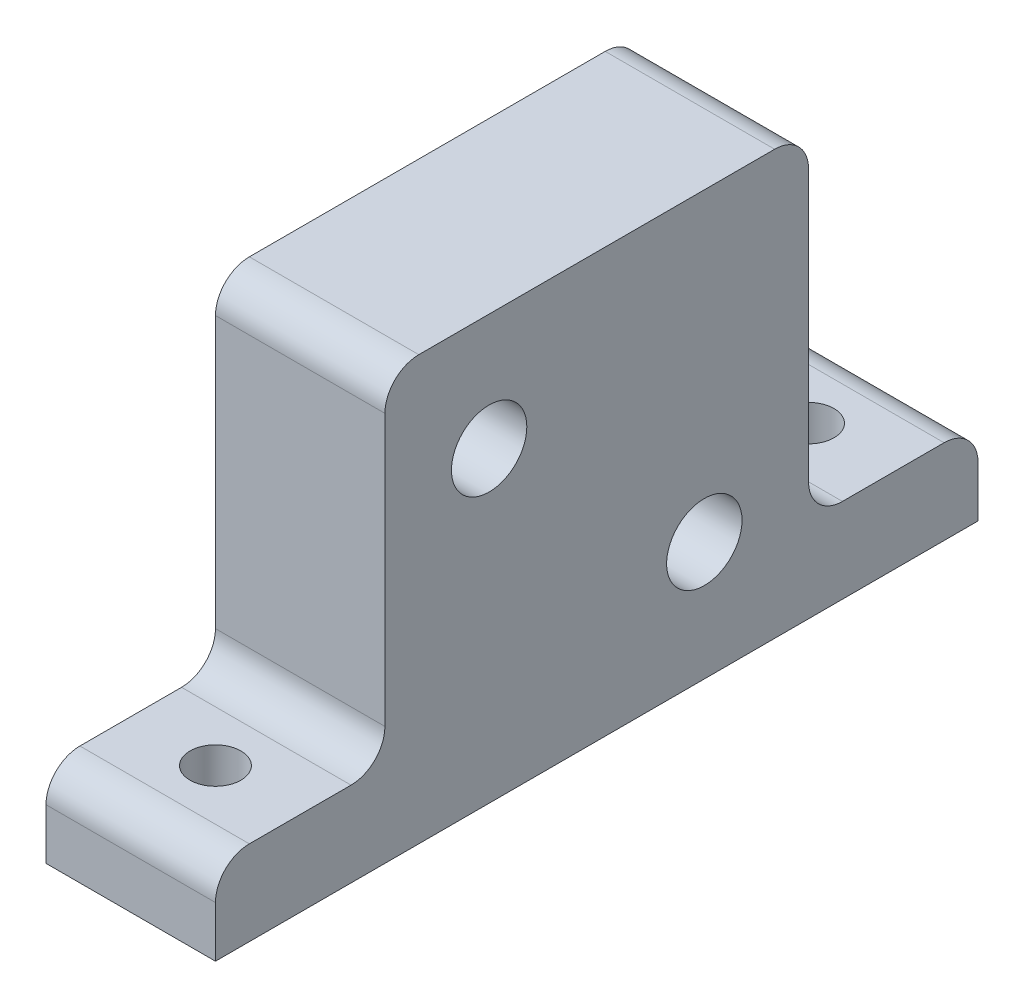
ISO-10303-21;
HEADER;
FILE_DESCRIPTION(('STEP AP214'),'2;1');
FILE_NAME('part.step','',(''),(''),'','','');
FILE_SCHEMA(('AUTOMOTIVE_DESIGN { 1 0 10303 214 1 1 1 1 }'));
ENDSEC;
DATA;
#1=APPLICATION_CONTEXT('core data for automotive mechanical design processes');
#2=APPLICATION_PROTOCOL_DEFINITION('international standard','automotive_design',2000,#1);
#3=PRODUCT_CONTEXT('',#1,'mechanical');
#4=PRODUCT('Part','Part','',(#3));
#5=PRODUCT_RELATED_PRODUCT_CATEGORY('part','',(#4));
#6=PRODUCT_DEFINITION_FORMATION('','',#4);
#7=PRODUCT_DEFINITION_CONTEXT('part definition',#1,'design');
#8=PRODUCT_DEFINITION('design','',#6,#7);
#9=PRODUCT_DEFINITION_SHAPE('','',#8);
#10=(LENGTH_UNIT() NAMED_UNIT(*) SI_UNIT(.MILLI.,.METRE.));
#11=(NAMED_UNIT(*) PLANE_ANGLE_UNIT() SI_UNIT($,.RADIAN.));
#12=(NAMED_UNIT(*) SI_UNIT($,.STERADIAN.) SOLID_ANGLE_UNIT());
#13=UNCERTAINTY_MEASURE_WITH_UNIT(LENGTH_MEASURE(1.E-05),#10,'distance_accuracy_value','');
#14=(GEOMETRIC_REPRESENTATION_CONTEXT(3) GLOBAL_UNCERTAINTY_ASSIGNED_CONTEXT((#13)) GLOBAL_UNIT_ASSIGNED_CONTEXT((#10,
#11,#12)) REPRESENTATION_CONTEXT('',''));
#15=CARTESIAN_POINT('',(0.,0.,0.));
#16=DIRECTION('',(0.,0.,1.));
#17=DIRECTION('',(1.,0.,0.));
#18=AXIS2_PLACEMENT_3D('',#15,#16,#17);
#19=CARTESIAN_POINT('',(165.,0.,97.5));
#20=DIRECTION('',(0.,0.,1.));
#21=DIRECTION('',(1.,0.,0.));
#22=AXIS2_PLACEMENT_3D('',#19,#20,#21);
#23=PLANE('',#22);
#24=DIRECTION('',(0.,1.,0.));
#25=VECTOR('',#24,1.);
#26=CARTESIAN_POINT('',(165.,0.,97.5));
#27=LINE('',#26,#25);
#28=CARTESIAN_POINT('',(165.,15.,97.5));
#29=VERTEX_POINT('',#28);
#30=CARTESIAN_POINT('',(165.,18.,97.5));
#31=VERTEX_POINT('',#30);
#32=EDGE_CURVE('E147',#29,#31,#27,.T.);
#33=ORIENTED_EDGE('',*,*,#32,.T.);
#34=DIRECTION('',(-1.,0.,0.));
#35=VECTOR('',#34,1.);
#36=CARTESIAN_POINT('',(165.,18.,97.5));
#37=LINE('',#36,#35);
#38=CARTESIAN_POINT('',(155.,18.,97.5));
#39=VERTEX_POINT('',#38);
#40=EDGE_CURVE('E263',#31,#39,#37,.T.);
#41=ORIENTED_EDGE('',*,*,#40,.T.);
#42=DIRECTION('',(0.,1.,0.));
#43=VECTOR('',#42,1.);
#44=CARTESIAN_POINT('',(155.,0.,97.5));
#45=LINE('',#44,#43);
#46=CARTESIAN_POINT('',(155.,15.,97.5));
#47=VERTEX_POINT('',#46);
#48=EDGE_CURVE('E150',#47,#39,#45,.T.);
#49=ORIENTED_EDGE('',*,*,#48,.F.);
#50=DIRECTION('',(-1.,0.,0.));
#51=VECTOR('',#50,1.);
#52=CARTESIAN_POINT('',(165.,15.,97.5));
#53=LINE('',#52,#51);
#54=EDGE_CURVE('E143',#29,#47,#53,.T.);
#55=ORIENTED_EDGE('',*,*,#54,.F.);
#56=EDGE_LOOP('',(#33,#41,#49,#55));
#57=FACE_BOUND('',#56,.T.);
#58=ADVANCED_FACE('F41',(#57),#23,.T.);
#59=CARTESIAN_POINT('',(165.,15.,0.));
#60=DIRECTION('',(0.,1.,0.));
#61=DIRECTION('',(0.,0.,1.));
#62=AXIS2_PLACEMENT_3D('',#59,#60,#61);
#63=PLANE('',#62);
#64=CARTESIAN_POINT('',(160.,15.,92.5));
#65=DIRECTION('',(0.,1.,0.));
#66=DIRECTION('',(0.,0.,1.));
#67=AXIS2_PLACEMENT_3D('',#64,#65,#66);
#68=CIRCLE('',#67,1.5);
#69=CARTESIAN_POINT('',(160.,15.,91.));
#70=VERTEX_POINT('',#69);
#71=EDGE_CURVE('E543',#70,#70,#68,.T.);
#72=ORIENTED_EDGE('',*,*,#71,.T.);
#73=EDGE_LOOP('',(#72));
#74=FACE_BOUND('',#73,.T.);
#75=CARTESIAN_POINT('',(160.,15.,57.5));
#76=DIRECTION('',(0.,1.,0.));
#77=DIRECTION('',(0.,0.,1.));
#78=AXIS2_PLACEMENT_3D('',#75,#76,#77);
#79=CIRCLE('',#78,1.5);
#80=CARTESIAN_POINT('',(160.,15.,56.));
#81=VERTEX_POINT('',#80);
#82=EDGE_CURVE('E175',#81,#81,#79,.T.);
#83=ORIENTED_EDGE('',*,*,#82,.T.);
#84=EDGE_LOOP('',(#83));
#85=FACE_BOUND('',#84,.T.);
#86=DIRECTION('',(0.,0.,-1.));
#87=VECTOR('',#86,1.);
#88=CARTESIAN_POINT('',(155.,15.,0.));
#89=LINE('',#88,#87);
#90=CARTESIAN_POINT('',(155.,15.,52.5));
#91=VERTEX_POINT('',#90);
#92=EDGE_CURVE('E199',#47,#91,#89,.T.);
#93=ORIENTED_EDGE('',*,*,#92,.T.);
#94=DIRECTION('',(-1.,0.,0.));
#95=VECTOR('',#94,1.);
#96=CARTESIAN_POINT('',(165.,15.,52.5));
#97=LINE('',#96,#95);
#98=CARTESIAN_POINT('',(165.,15.,52.5));
#99=VERTEX_POINT('',#98);
#100=EDGE_CURVE('E154',#99,#91,#97,.T.);
#101=ORIENTED_EDGE('',*,*,#100,.F.);
#102=DIRECTION('',(0.,0.,-1.));
#103=VECTOR('',#102,1.);
#104=CARTESIAN_POINT('',(165.,15.,0.));
#105=LINE('',#104,#103);
#106=EDGE_CURVE('E157',#29,#99,#105,.T.);
#107=ORIENTED_EDGE('',*,*,#106,.F.);
#108=ORIENTED_EDGE('',*,*,#54,.T.);
#109=EDGE_LOOP('',(#93,#101,#107,#108));
#110=FACE_BOUND('',#109,.T.);
#111=ADVANCED_FACE('F158',(#74,#85,#110),#63,.F.);
#112=CARTESIAN_POINT('',(165.,2.18575157973078E-13,52.5000000000001));
#113=DIRECTION('',(0.,0.,1.));
#114=DIRECTION('',(0.,-1.,0.));
#115=AXIS2_PLACEMENT_3D('',#112,#113,#114);
#116=PLANE('',#115);
#117=DIRECTION('',(0.,1.,0.));
#118=VECTOR('',#117,1.);
#119=CARTESIAN_POINT('',(155.,2.18575157973078E-13,52.5000000000001));
#120=LINE('',#119,#118);
#121=CARTESIAN_POINT('',(155.,18.,52.5));
#122=VERTEX_POINT('',#121);
#123=EDGE_CURVE('E202',#91,#122,#120,.T.);
#124=ORIENTED_EDGE('',*,*,#123,.T.);
#125=DIRECTION('',(-1.,0.,0.));
#126=VECTOR('',#125,1.);
#127=CARTESIAN_POINT('',(165.,18.,52.5));
#128=LINE('',#127,#126);
#129=CARTESIAN_POINT('',(165.,18.,52.5));
#130=VERTEX_POINT('',#129);
#131=EDGE_CURVE('E251',#122,#130,#128,.F.);
#132=ORIENTED_EDGE('',*,*,#131,.T.);
#133=DIRECTION('',(0.,1.,0.));
#134=VECTOR('',#133,1.);
#135=CARTESIAN_POINT('',(165.,2.18575157973078E-13,52.5000000000001));
#136=LINE('',#135,#134);
#137=EDGE_CURVE('E162',#99,#130,#136,.T.);
#138=ORIENTED_EDGE('',*,*,#137,.F.);
#139=ORIENTED_EDGE('',*,*,#100,.T.);
#140=EDGE_LOOP('',(#124,#132,#138,#139));
#141=FACE_BOUND('',#140,.T.);
#142=ADVANCED_FACE('F288',(#141),#116,.F.);
#143=CARTESIAN_POINT('',(165.,20.,0.));
#144=DIRECTION('',(0.,-1.,0.));
#145=DIRECTION('',(0.,0.,-1.));
#146=AXIS2_PLACEMENT_3D('',#143,#144,#145);
#147=PLANE('',#146);
#148=CARTESIAN_POINT('',(160.,20.,57.5));
#149=DIRECTION('',(0.,-1.,0.));
#150=DIRECTION('',(0.,0.,-1.));
#151=AXIS2_PLACEMENT_3D('',#148,#149,#150);
#152=CIRCLE('',#151,1.5);
#153=CARTESIAN_POINT('',(160.,20.,56.));
#154=VERTEX_POINT('',#153);
#155=EDGE_CURVE('E541',#154,#154,#152,.T.);
#156=ORIENTED_EDGE('',*,*,#155,.T.);
#157=EDGE_LOOP('',(#156));
#158=FACE_BOUND('',#157,.T.);
#159=DIRECTION('',(0.,0.,1.));
#160=VECTOR('',#159,1.);
#161=CARTESIAN_POINT('',(155.,20.,0.));
#162=LINE('',#161,#160);
#163=CARTESIAN_POINT('',(155.,20.,54.5));
#164=VERTEX_POINT('',#163);
#165=CARTESIAN_POINT('',(155.,20.,60.5));
#166=VERTEX_POINT('',#165);
#167=EDGE_CURVE('E205',#164,#166,#162,.T.);
#168=ORIENTED_EDGE('',*,*,#167,.T.);
#169=DIRECTION('',(-1.,0.,0.));
#170=VECTOR('',#169,1.);
#171=CARTESIAN_POINT('',(165.,20.,60.5));
#172=LINE('',#171,#170);
#173=CARTESIAN_POINT('',(165.,20.,60.5));
#174=VERTEX_POINT('',#173);
#175=EDGE_CURVE('E231',#166,#174,#172,.F.);
#176=ORIENTED_EDGE('',*,*,#175,.T.);
#177=DIRECTION('',(0.,0.,1.));
#178=VECTOR('',#177,1.);
#179=CARTESIAN_POINT('',(165.,20.,0.));
#180=LINE('',#179,#178);
#181=CARTESIAN_POINT('',(165.,20.,54.5));
#182=VERTEX_POINT('',#181);
#183=EDGE_CURVE('E179',#182,#174,#180,.T.);
#184=ORIENTED_EDGE('',*,*,#183,.F.);
#185=DIRECTION('',(-1.,0.,0.));
#186=VECTOR('',#185,1.);
#187=CARTESIAN_POINT('',(165.,20.,54.5));
#188=LINE('',#187,#186);
#189=EDGE_CURVE('E228',#182,#164,#188,.T.);
#190=ORIENTED_EDGE('',*,*,#189,.T.);
#191=EDGE_LOOP('',(#168,#176,#184,#190));
#192=FACE_BOUND('',#191,.T.);
#193=ADVANCED_FACE('F296',(#158,#192),#147,.F.);
#194=CARTESIAN_POINT('',(165.,0.,62.5));
#195=DIRECTION('',(0.,0.,1.));
#196=DIRECTION('',(0.,-1.,0.));
#197=AXIS2_PLACEMENT_3D('',#194,#195,#196);
#198=PLANE('',#197);
#199=DIRECTION('',(0.,1.,0.));
#200=VECTOR('',#199,1.);
#201=CARTESIAN_POINT('',(165.,0.,62.5));
#202=LINE('',#201,#200);
#203=CARTESIAN_POINT('',(165.,22.,62.5));
#204=VERTEX_POINT('',#203);
#205=CARTESIAN_POINT('',(165.,38.,62.5));
#206=VERTEX_POINT('',#205);
#207=EDGE_CURVE('E182',#204,#206,#202,.T.);
#208=ORIENTED_EDGE('',*,*,#207,.F.);
#209=DIRECTION('',(-1.,0.,0.));
#210=VECTOR('',#209,1.);
#211=CARTESIAN_POINT('',(155.,22.,62.5));
#212=LINE('',#211,#210);
#213=CARTESIAN_POINT('',(155.,22.,62.5));
#214=VERTEX_POINT('',#213);
#215=EDGE_CURVE('E225',#204,#214,#212,.T.);
#216=ORIENTED_EDGE('',*,*,#215,.T.);
#217=DIRECTION('',(0.,1.,0.));
#218=VECTOR('',#217,1.);
#219=CARTESIAN_POINT('',(155.,0.,62.5));
#220=LINE('',#219,#218);
#221=CARTESIAN_POINT('',(155.,38.,62.5));
#222=VERTEX_POINT('',#221);
#223=EDGE_CURVE('E208',#214,#222,#220,.T.);
#224=ORIENTED_EDGE('',*,*,#223,.T.);
#225=DIRECTION('',(-1.,0.,0.));
#226=VECTOR('',#225,1.);
#227=CARTESIAN_POINT('',(165.,38.,62.5));
#228=LINE('',#227,#226);
#229=EDGE_CURVE('E153',#222,#206,#228,.F.);
#230=ORIENTED_EDGE('',*,*,#229,.T.);
#231=EDGE_LOOP('',(#208,#216,#224,#230));
#232=FACE_BOUND('',#231,.T.);
#233=ADVANCED_FACE('F305',(#232),#198,.F.);
#234=CARTESIAN_POINT('',(165.,40.,0.));
#235=DIRECTION('',(0.,1.,0.));
#236=DIRECTION('',(0.,0.,1.));
#237=AXIS2_PLACEMENT_3D('',#234,#235,#236);
#238=PLANE('',#237);
#239=DIRECTION('',(0.,0.,-1.));
#240=VECTOR('',#239,1.);
#241=CARTESIAN_POINT('',(165.,40.,0.));
#242=LINE('',#241,#240);
#243=CARTESIAN_POINT('',(165.,40.,85.5));
#244=VERTEX_POINT('',#243);
#245=CARTESIAN_POINT('',(165.,40.,64.5));
#246=VERTEX_POINT('',#245);
#247=EDGE_CURVE('E184',#244,#246,#242,.T.);
#248=ORIENTED_EDGE('',*,*,#247,.T.);
#249=DIRECTION('',(-1.,0.,0.));
#250=VECTOR('',#249,1.);
#251=CARTESIAN_POINT('',(155.,40.,64.5));
#252=LINE('',#251,#250);
#253=CARTESIAN_POINT('',(155.,40.,64.5));
#254=VERTEX_POINT('',#253);
#255=EDGE_CURVE('E260',#246,#254,#252,.T.);
#256=ORIENTED_EDGE('',*,*,#255,.T.);
#257=DIRECTION('',(0.,0.,-1.));
#258=VECTOR('',#257,1.);
#259=CARTESIAN_POINT('',(155.,40.,0.));
#260=LINE('',#259,#258);
#261=CARTESIAN_POINT('',(155.,40.,85.5));
#262=VERTEX_POINT('',#261);
#263=EDGE_CURVE('E211',#262,#254,#260,.T.);
#264=ORIENTED_EDGE('',*,*,#263,.F.);
#265=DIRECTION('',(-1.,0.,0.));
#266=VECTOR('',#265,1.);
#267=CARTESIAN_POINT('',(165.,40.,85.5));
#268=LINE('',#267,#266);
#269=EDGE_CURVE('E63',#262,#244,#268,.F.);
#270=ORIENTED_EDGE('',*,*,#269,.T.);
#271=EDGE_LOOP('',(#248,#256,#264,#270));
#272=FACE_BOUND('',#271,.T.);
#273=ADVANCED_FACE('F310',(#272),#238,.T.);
#274=CARTESIAN_POINT('',(165.,0.,87.5));
#275=DIRECTION('',(0.,0.,1.));
#276=DIRECTION('',(0.,-1.,0.));
#277=AXIS2_PLACEMENT_3D('',#274,#275,#276);
#278=PLANE('',#277);
#279=DIRECTION('',(0.,1.,0.));
#280=VECTOR('',#279,1.);
#281=CARTESIAN_POINT('',(155.,0.,87.5));
#282=LINE('',#281,#280);
#283=CARTESIAN_POINT('',(155.,22.,87.5));
#284=VERTEX_POINT('',#283);
#285=CARTESIAN_POINT('',(155.,38.,87.5));
#286=VERTEX_POINT('',#285);
#287=EDGE_CURVE('E172',#284,#286,#282,.T.);
#288=ORIENTED_EDGE('',*,*,#287,.F.);
#289=DIRECTION('',(-1.,0.,0.));
#290=VECTOR('',#289,1.);
#291=CARTESIAN_POINT('',(165.,22.,87.5));
#292=LINE('',#291,#290);
#293=CARTESIAN_POINT('',(165.,22.,87.5));
#294=VERTEX_POINT('',#293);
#295=EDGE_CURVE('E241',#284,#294,#292,.F.);
#296=ORIENTED_EDGE('',*,*,#295,.T.);
#297=DIRECTION('',(0.,1.,0.));
#298=VECTOR('',#297,1.);
#299=CARTESIAN_POINT('',(165.,0.,87.5));
#300=LINE('',#299,#298);
#301=CARTESIAN_POINT('',(165.,38.,87.5));
#302=VERTEX_POINT('',#301);
#303=EDGE_CURVE('E186',#294,#302,#300,.T.);
#304=ORIENTED_EDGE('',*,*,#303,.T.);
#305=DIRECTION('',(-1.,0.,0.));
#306=VECTOR('',#305,1.);
#307=CARTESIAN_POINT('',(165.,38.,87.5));
#308=LINE('',#307,#306);
#309=EDGE_CURVE('E238',#302,#286,#308,.T.);
#310=ORIENTED_EDGE('',*,*,#309,.T.);
#311=EDGE_LOOP('',(#288,#296,#304,#310));
#312=FACE_BOUND('',#311,.T.);
#313=ADVANCED_FACE('F277',(#312),#278,.T.);
#314=CARTESIAN_POINT('',(165.,33.13,81.35));
#315=DIRECTION('',(-1.,0.,0.));
#316=DIRECTION('',(0.,0.,1.));
#317=AXIS2_PLACEMENT_3D('',#314,#315,#316);
#318=CYLINDRICAL_SURFACE('',#317,2.22500000000001);
#319=CARTESIAN_POINT('',(160.,33.13,81.35));
#320=DIRECTION('',(1.,0.,0.));
#321=DIRECTION('',(0.,0.,-1.));
#322=AXIS2_PLACEMENT_3D('',#319,#320,#321);
#323=CIRCLE('',#322,2.22500000000001);
#324=CARTESIAN_POINT('',(160.,33.13,79.125));
#325=VERTEX_POINT('',#324);
#326=EDGE_CURVE('E220',#325,#325,#323,.T.);
#327=ORIENTED_EDGE('',*,*,#326,.F.);
#328=EDGE_LOOP('',(#327));
#329=FACE_BOUND('',#328,.T.);
#330=CARTESIAN_POINT('',(165.,33.13,81.35));
#331=DIRECTION('',(1.,0.,0.));
#332=DIRECTION('',(0.,0.,-1.));
#333=AXIS2_PLACEMENT_3D('',#330,#331,#332);
#334=CIRCLE('',#333,2.22500000000001);
#335=CARTESIAN_POINT('',(165.,33.13,79.125));
#336=VERTEX_POINT('',#335);
#337=EDGE_CURVE('E192',#336,#336,#334,.T.);
#338=ORIENTED_EDGE('',*,*,#337,.T.);
#339=EDGE_LOOP('',(#338));
#340=FACE_BOUND('',#339,.T.);
#341=ADVANCED_FACE('F455',(#329,#340),#318,.F.);
#342=CARTESIAN_POINT('',(165.,20.,0.));
#343=DIRECTION('',(0.,1.,0.));
#344=DIRECTION('',(0.,0.,1.));
#345=AXIS2_PLACEMENT_3D('',#342,#343,#344);
#346=PLANE('',#345);
#347=CARTESIAN_POINT('',(160.,20.,92.5));
#348=DIRECTION('',(0.,1.,0.));
#349=DIRECTION('',(0.,0.,1.));
#350=AXIS2_PLACEMENT_3D('',#347,#348,#349);
#351=CIRCLE('',#350,1.5);
#352=CARTESIAN_POINT('',(160.,20.,91.));
#353=VERTEX_POINT('',#352);
#354=EDGE_CURVE('E200',#353,#353,#351,.T.);
#355=ORIENTED_EDGE('',*,*,#354,.F.);
#356=EDGE_LOOP('',(#355));
#357=FACE_BOUND('',#356,.T.);
#358=DIRECTION('',(0.,0.,-1.));
#359=VECTOR('',#358,1.);
#360=CARTESIAN_POINT('',(165.,20.,0.));
#361=LINE('',#360,#359);
#362=CARTESIAN_POINT('',(165.,20.,95.5));
#363=VERTEX_POINT('',#362);
#364=CARTESIAN_POINT('',(165.,20.,89.5));
#365=VERTEX_POINT('',#364);
#366=EDGE_CURVE('E189',#363,#365,#361,.T.);
#367=ORIENTED_EDGE('',*,*,#366,.T.);
#368=DIRECTION('',(-1.,0.,0.));
#369=VECTOR('',#368,1.);
#370=CARTESIAN_POINT('',(155.,20.,89.5));
#371=LINE('',#370,#369);
#372=CARTESIAN_POINT('',(155.,20.,89.5));
#373=VERTEX_POINT('',#372);
#374=EDGE_CURVE('E235',#365,#373,#371,.T.);
#375=ORIENTED_EDGE('',*,*,#374,.T.);
#376=DIRECTION('',(0.,0.,-1.));
#377=VECTOR('',#376,1.);
#378=CARTESIAN_POINT('',(155.,20.,0.));
#379=LINE('',#378,#377);
#380=CARTESIAN_POINT('',(155.,20.,95.5));
#381=VERTEX_POINT('',#380);
#382=EDGE_CURVE('E169',#381,#373,#379,.T.);
#383=ORIENTED_EDGE('',*,*,#382,.F.);
#384=DIRECTION('',(-1.,0.,0.));
#385=VECTOR('',#384,1.);
#386=CARTESIAN_POINT('',(165.,20.,95.5));
#387=LINE('',#386,#385);
#388=EDGE_CURVE('E233',#381,#363,#387,.F.);
#389=ORIENTED_EDGE('',*,*,#388,.T.);
#390=EDGE_LOOP('',(#367,#375,#383,#389));
#391=FACE_BOUND('',#390,.T.);
#392=ADVANCED_FACE('F283',(#357,#391),#346,.T.);
#393=CARTESIAN_POINT('',(165.,22.,68.65));
#394=DIRECTION('',(-1.,0.,0.));
#395=DIRECTION('',(0.,0.,1.));
#396=AXIS2_PLACEMENT_3D('',#393,#394,#395);
#397=CYLINDRICAL_SURFACE('',#396,2.22500000000001);
#398=CARTESIAN_POINT('',(160.,22.,68.65));
#399=DIRECTION('',(1.,0.,0.));
#400=DIRECTION('',(0.,0.,-1.));
#401=AXIS2_PLACEMENT_3D('',#398,#399,#400);
#402=CIRCLE('',#401,2.22500000000001);
#403=CARTESIAN_POINT('',(160.,22.,66.425));
#404=VERTEX_POINT('',#403);
#405=EDGE_CURVE('E217',#404,#404,#402,.T.);
#406=ORIENTED_EDGE('',*,*,#405,.F.);
#407=EDGE_LOOP('',(#406));
#408=FACE_BOUND('',#407,.T.);
#409=CARTESIAN_POINT('',(165.,22.,68.65));
#410=DIRECTION('',(1.,0.,0.));
#411=DIRECTION('',(0.,0.,-1.));
#412=AXIS2_PLACEMENT_3D('',#409,#410,#411);
#413=CIRCLE('',#412,2.22500000000001);
#414=CARTESIAN_POINT('',(165.,22.,66.425));
#415=VERTEX_POINT('',#414);
#416=EDGE_CURVE('E195',#415,#415,#413,.T.);
#417=ORIENTED_EDGE('',*,*,#416,.T.);
#418=EDGE_LOOP('',(#417));
#419=FACE_BOUND('',#418,.T.);
#420=ADVANCED_FACE('F438',(#408,#419),#397,.F.);
#421=CARTESIAN_POINT('',(165.,0.,0.));
#422=DIRECTION('',(1.,0.,0.));
#423=DIRECTION('',(0.,0.,-1.));
#424=AXIS2_PLACEMENT_3D('',#421,#422,#423);
#425=PLANE('',#424);
#426=ORIENTED_EDGE('',*,*,#137,.T.);
#427=CARTESIAN_POINT('',(165.,18.,54.5));
#428=DIRECTION('',(1.,0.,0.));
#429=DIRECTION('',(0.,0.,-1.));
#430=AXIS2_PLACEMENT_3D('',#427,#428,#429);
#431=CIRCLE('',#430,2.);
#432=EDGE_CURVE('E257',#130,#182,#431,.T.);
#433=ORIENTED_EDGE('',*,*,#432,.T.);
#434=ORIENTED_EDGE('',*,*,#183,.T.);
#435=CARTESIAN_POINT('',(165.,22.,60.5));
#436=DIRECTION('',(1.,0.,0.));
#437=DIRECTION('',(0.,0.,-1.));
#438=AXIS2_PLACEMENT_3D('',#435,#436,#437);
#439=CIRCLE('',#438,2.);
#440=EDGE_CURVE('E267',#174,#204,#439,.F.);
#441=ORIENTED_EDGE('',*,*,#440,.T.);
#442=ORIENTED_EDGE('',*,*,#207,.T.);
#443=CARTESIAN_POINT('',(165.,38.,64.5));
#444=DIRECTION('',(1.,0.,0.));
#445=DIRECTION('',(0.,0.,-1.));
#446=AXIS2_PLACEMENT_3D('',#443,#444,#445);
#447=CIRCLE('',#446,2.);
#448=EDGE_CURVE('E56',#206,#246,#447,.T.);
#449=ORIENTED_EDGE('',*,*,#448,.T.);
#450=ORIENTED_EDGE('',*,*,#247,.F.);
#451=CARTESIAN_POINT('',(165.,38.,85.5));
#452=DIRECTION('',(1.,0.,0.));
#453=DIRECTION('',(0.,0.,-1.));
#454=AXIS2_PLACEMENT_3D('',#451,#452,#453);
#455=CIRCLE('',#454,2.);
#456=EDGE_CURVE('E254',#244,#302,#455,.T.);
#457=ORIENTED_EDGE('',*,*,#456,.T.);
#458=ORIENTED_EDGE('',*,*,#303,.F.);
#459=CARTESIAN_POINT('',(165.,22.,89.5));
#460=DIRECTION('',(1.,0.,0.));
#461=DIRECTION('',(0.,0.,-1.));
#462=AXIS2_PLACEMENT_3D('',#459,#460,#461);
#463=CIRCLE('',#462,2.);
#464=EDGE_CURVE('E11',#294,#365,#463,.F.);
#465=ORIENTED_EDGE('',*,*,#464,.T.);
#466=ORIENTED_EDGE('',*,*,#366,.F.);
#467=CARTESIAN_POINT('',(165.,18.,95.5));
#468=DIRECTION('',(1.,0.,0.));
#469=DIRECTION('',(0.,0.,-1.));
#470=AXIS2_PLACEMENT_3D('',#467,#468,#469);
#471=CIRCLE('',#470,2.);
#472=EDGE_CURVE('E168',#363,#31,#471,.T.);
#473=ORIENTED_EDGE('',*,*,#472,.T.);
#474=ORIENTED_EDGE('',*,*,#32,.F.);
#475=ORIENTED_EDGE('',*,*,#106,.T.);
#476=EDGE_LOOP('',(#426,#433,#434,#441,#442,#449,#450,#457,#458,#465,#466,#473,#474,#475));
#477=FACE_BOUND('',#476,.T.);
#478=ORIENTED_EDGE('',*,*,#337,.F.);
#479=EDGE_LOOP('',(#478));
#480=FACE_BOUND('',#479,.T.);
#481=ORIENTED_EDGE('',*,*,#416,.F.);
#482=EDGE_LOOP('',(#481));
#483=FACE_BOUND('',#482,.T.);
#484=ADVANCED_FACE('F164',(#477,#480,#483),#425,.T.);
#485=CARTESIAN_POINT('',(155.,0.,0.));
#486=DIRECTION('',(1.,0.,0.));
#487=DIRECTION('',(0.,0.,-1.));
#488=AXIS2_PLACEMENT_3D('',#485,#486,#487);
#489=PLANE('',#488);
#490=CARTESIAN_POINT('',(155.,22.,68.65));
#491=DIRECTION('',(1.,0.,0.));
#492=DIRECTION('',(0.,0.,-1.));
#493=AXIS2_PLACEMENT_3D('',#490,#491,#492);
#494=CIRCLE('',#493,3.93499999999999);
#495=CARTESIAN_POINT('',(155.,22.,64.715));
#496=VERTEX_POINT('',#495);
#497=EDGE_CURVE('E556',#496,#496,#494,.T.);
#498=ORIENTED_EDGE('',*,*,#497,.T.);
#499=EDGE_LOOP('',(#498));
#500=FACE_BOUND('',#499,.T.);
#501=CARTESIAN_POINT('',(155.,33.13,81.35));
#502=DIRECTION('',(1.,0.,0.));
#503=DIRECTION('',(0.,0.,-1.));
#504=AXIS2_PLACEMENT_3D('',#501,#502,#503);
#505=CIRCLE('',#504,3.93499999999999);
#506=CARTESIAN_POINT('',(155.,33.13,77.415));
#507=VERTEX_POINT('',#506);
#508=EDGE_CURVE('E553',#507,#507,#505,.T.);
#509=ORIENTED_EDGE('',*,*,#508,.T.);
#510=EDGE_LOOP('',(#509));
#511=FACE_BOUND('',#510,.T.);
#512=ORIENTED_EDGE('',*,*,#167,.F.);
#513=CARTESIAN_POINT('',(155.,18.,54.5));
#514=DIRECTION('',(1.,0.,0.));
#515=DIRECTION('',(0.,0.,-1.));
#516=AXIS2_PLACEMENT_3D('',#513,#514,#515);
#517=CIRCLE('',#516,2.);
#518=EDGE_CURVE('E249',#164,#122,#517,.F.);
#519=ORIENTED_EDGE('',*,*,#518,.T.);
#520=ORIENTED_EDGE('',*,*,#123,.F.);
#521=ORIENTED_EDGE('',*,*,#92,.F.);
#522=ORIENTED_EDGE('',*,*,#48,.T.);
#523=CARTESIAN_POINT('',(155.,18.,95.5));
#524=DIRECTION('',(1.,0.,0.));
#525=DIRECTION('',(0.,0.,-1.));
#526=AXIS2_PLACEMENT_3D('',#523,#524,#525);
#527=CIRCLE('',#526,2.);
#528=EDGE_CURVE('E243',#39,#381,#527,.F.);
#529=ORIENTED_EDGE('',*,*,#528,.T.);
#530=ORIENTED_EDGE('',*,*,#382,.T.);
#531=CARTESIAN_POINT('',(155.,22.,89.5));
#532=DIRECTION('',(1.,0.,0.));
#533=DIRECTION('',(0.,0.,-1.));
#534=AXIS2_PLACEMENT_3D('',#531,#532,#533);
#535=CIRCLE('',#534,2.);
#536=EDGE_CURVE('E49',#373,#284,#535,.T.);
#537=ORIENTED_EDGE('',*,*,#536,.T.);
#538=ORIENTED_EDGE('',*,*,#287,.T.);
#539=CARTESIAN_POINT('',(155.,38.,85.5));
#540=DIRECTION('',(1.,0.,0.));
#541=DIRECTION('',(0.,0.,-1.));
#542=AXIS2_PLACEMENT_3D('',#539,#540,#541);
#543=CIRCLE('',#542,2.);
#544=EDGE_CURVE('E245',#286,#262,#543,.F.);
#545=ORIENTED_EDGE('',*,*,#544,.T.);
#546=ORIENTED_EDGE('',*,*,#263,.T.);
#547=CARTESIAN_POINT('',(155.,38.,64.5));
#548=DIRECTION('',(1.,0.,0.));
#549=DIRECTION('',(0.,0.,-1.));
#550=AXIS2_PLACEMENT_3D('',#547,#548,#549);
#551=CIRCLE('',#550,2.);
#552=EDGE_CURVE('E247',#254,#222,#551,.F.);
#553=ORIENTED_EDGE('',*,*,#552,.T.);
#554=ORIENTED_EDGE('',*,*,#223,.F.);
#555=CARTESIAN_POINT('',(155.,22.,60.5));
#556=DIRECTION('',(1.,0.,0.));
#557=DIRECTION('',(0.,0.,-1.));
#558=AXIS2_PLACEMENT_3D('',#555,#556,#557);
#559=CIRCLE('',#558,2.);
#560=EDGE_CURVE('E265',#214,#166,#559,.T.);
#561=ORIENTED_EDGE('',*,*,#560,.T.);
#562=EDGE_LOOP('',(#512,#519,#520,#521,#522,#529,#530,#537,#538,#545,#546,#553,#554,#561));
#563=FACE_BOUND('',#562,.T.);
#564=ADVANCED_FACE('F271',(#500,#511,#563),#489,.F.);
#565=CARTESIAN_POINT('',(160.,40.001,92.5));
#566=DIRECTION('',(0.,-1.,0.));
#567=DIRECTION('',(0.,0.,-1.));
#568=AXIS2_PLACEMENT_3D('',#565,#566,#567);
#569=CYLINDRICAL_SURFACE('',#568,1.5);
#570=CARTESIAN_POINT('',(160.,20.,91.));
#571=CARTESIAN_POINT('',(160.,19.9479166666667,91.));
#572=CARTESIAN_POINT('',(160.,19.8958333333333,91.));
#573=CARTESIAN_POINT('',(160.,19.7916666666667,91.));
#574=CARTESIAN_POINT('',(160.,19.7395833333333,91.));
#575=CARTESIAN_POINT('',(160.,19.6354166666667,91.));
#576=CARTESIAN_POINT('',(160.,19.5833333333333,91.));
#577=CARTESIAN_POINT('',(160.,19.4791666666667,91.));
#578=CARTESIAN_POINT('',(160.,19.4270833333333,91.));
#579=CARTESIAN_POINT('',(160.,19.3229166666667,91.));
#580=CARTESIAN_POINT('',(160.,19.2708333333333,91.));
#581=CARTESIAN_POINT('',(160.,19.1666666666667,91.));
#582=CARTESIAN_POINT('',(160.,19.1145833333333,91.));
#583=CARTESIAN_POINT('',(160.,19.0104166666667,91.));
#584=CARTESIAN_POINT('',(160.,18.9583333333333,91.));
#585=CARTESIAN_POINT('',(160.,18.8541666666667,91.));
#586=CARTESIAN_POINT('',(160.,18.8020833333333,91.));
#587=CARTESIAN_POINT('',(160.,18.6979166666667,91.));
#588=CARTESIAN_POINT('',(160.,18.6458333333333,91.));
#589=CARTESIAN_POINT('',(160.,18.5416666666667,91.));
#590=CARTESIAN_POINT('',(160.,18.4895833333333,91.));
#591=CARTESIAN_POINT('',(160.,18.3854166666667,91.));
#592=CARTESIAN_POINT('',(160.,18.3333333333333,91.));
#593=CARTESIAN_POINT('',(160.,18.2291666666667,91.));
#594=CARTESIAN_POINT('',(160.,18.1770833333333,91.));
#595=CARTESIAN_POINT('',(160.,18.0729166666667,91.));
#596=CARTESIAN_POINT('',(160.,18.0208333333333,91.));
#597=CARTESIAN_POINT('',(160.,17.9166666666667,91.));
#598=CARTESIAN_POINT('',(160.,17.8645833333333,91.));
#599=CARTESIAN_POINT('',(160.,17.7604166666667,91.));
#600=CARTESIAN_POINT('',(160.,17.7083333333333,91.));
#601=CARTESIAN_POINT('',(160.,17.6041666666667,91.));
#602=CARTESIAN_POINT('',(160.,17.5520833333333,91.));
#603=CARTESIAN_POINT('',(160.,17.4479166666667,91.));
#604=CARTESIAN_POINT('',(160.,17.3958333333333,91.));
#605=CARTESIAN_POINT('',(160.,17.2916666666667,91.));
#606=CARTESIAN_POINT('',(160.,17.2395833333333,91.));
#607=CARTESIAN_POINT('',(160.,17.1354166666667,91.));
#608=CARTESIAN_POINT('',(160.,17.0833333333333,91.));
#609=CARTESIAN_POINT('',(160.,16.9791666666667,91.));
#610=CARTESIAN_POINT('',(160.,16.9270833333333,91.));
#611=CARTESIAN_POINT('',(160.,16.8229166666667,91.));
#612=CARTESIAN_POINT('',(160.,16.7708333333333,91.));
#613=CARTESIAN_POINT('',(160.,16.6666666666667,91.));
#614=CARTESIAN_POINT('',(160.,16.6145833333333,91.));
#615=CARTESIAN_POINT('',(160.,16.5104166666667,91.));
#616=CARTESIAN_POINT('',(160.,16.4583333333333,91.));
#617=CARTESIAN_POINT('',(160.,16.3541666666667,91.));
#618=CARTESIAN_POINT('',(160.,16.3020833333333,91.));
#619=CARTESIAN_POINT('',(160.,16.1979166666667,91.));
#620=CARTESIAN_POINT('',(160.,16.1458333333333,91.));
#621=CARTESIAN_POINT('',(160.,16.0416666666667,91.));
#622=CARTESIAN_POINT('',(160.,15.9895833333333,91.));
#623=CARTESIAN_POINT('',(160.,15.8854166666667,91.));
#624=CARTESIAN_POINT('',(160.,15.8333333333333,91.));
#625=CARTESIAN_POINT('',(160.,15.7291666666667,91.));
#626=CARTESIAN_POINT('',(160.,15.6770833333333,91.));
#627=CARTESIAN_POINT('',(160.,15.5729166666667,91.));
#628=CARTESIAN_POINT('',(160.,15.5208333333333,91.));
#629=CARTESIAN_POINT('',(160.,15.4166666666667,91.));
#630=CARTESIAN_POINT('',(160.,15.3645833333333,91.));
#631=CARTESIAN_POINT('',(160.,15.2604166666667,91.));
#632=CARTESIAN_POINT('',(160.,15.2083333333333,91.));
#633=CARTESIAN_POINT('',(160.,15.1041666666667,91.));
#634=CARTESIAN_POINT('',(160.,15.0520833333333,91.));
#635=CARTESIAN_POINT('',(160.,15.,91.));
#636=B_SPLINE_CURVE_WITH_KNOTS('',3,(#570,#571,#572,#573,#574,#575,#576,#577,#578,#579,#580,
#581,#582,#583,#584,#585,#586,#587,#588,#589,#590,#591,#592,#593,#594,#595,#596,#597,#598,#599,
#600,#601,#602,#603,#604,#605,#606,#607,#608,#609,#610,#611,#612,#613,#614,#615,#616,#617,#618,
#619,#620,#621,#622,#623,#624,#625,#626,#627,#628,#629,#630,#631,#632,#633,#634,#635),
.UNSPECIFIED.,.F.,.F.,(4,2,2,2,2,2,2,2,2,2,2,2,2,2,2,2,2,2,2,2,2,2,2,2,2,2,2,2,2,2,2,2,4),(0.,
0.15625,0.3125,0.46875,0.625000000000001,0.781250000000001,0.937500000000001,1.09375,1.25,
1.40625,1.5625,1.71875,1.875,2.03125,2.1875,2.34375,2.5,2.65625,2.8125,2.96875,3.125,3.28125,
3.4375,3.59375,3.75,3.90625,4.0625,4.21875,4.375,4.53125,4.6875,4.84375,5.),.UNSPECIFIED.);
#637=EDGE_CURVE('BSEAM410',#353,#70,#636,.T.);
#638=ORIENTED_EDGE('',*,*,#354,.T.);
#639=ORIENTED_EDGE('',*,*,#71,.F.);
#640=ORIENTED_EDGE('',*,*,#637,.T.);
#641=ORIENTED_EDGE('',*,*,#637,.F.);
#642=EDGE_LOOP('',(#638,#640,#639,#641));
#643=FACE_BOUND('',#642,.T.);
#644=ADVANCED_FACE('F410',(#643),#569,.F.);
#645=CARTESIAN_POINT('',(160.,40.001,57.5));
#646=DIRECTION('',(0.,-1.,0.));
#647=DIRECTION('',(0.,0.,-1.));
#648=AXIS2_PLACEMENT_3D('',#645,#646,#647);
#649=CYLINDRICAL_SURFACE('',#648,1.5);
#650=CARTESIAN_POINT('',(160.,15.,56.));
#651=CARTESIAN_POINT('',(160.,15.0520833333333,56.));
#652=CARTESIAN_POINT('',(160.,15.1041666666667,56.));
#653=CARTESIAN_POINT('',(160.,15.2083333333333,56.));
#654=CARTESIAN_POINT('',(160.,15.2604166666667,56.));
#655=CARTESIAN_POINT('',(160.,15.3645833333333,56.));
#656=CARTESIAN_POINT('',(160.,15.4166666666667,56.));
#657=CARTESIAN_POINT('',(160.,15.5208333333333,56.));
#658=CARTESIAN_POINT('',(160.,15.5729166666667,56.));
#659=CARTESIAN_POINT('',(160.,15.6770833333333,56.));
#660=CARTESIAN_POINT('',(160.,15.7291666666667,56.));
#661=CARTESIAN_POINT('',(160.,15.8333333333333,56.));
#662=CARTESIAN_POINT('',(160.,15.8854166666667,56.));
#663=CARTESIAN_POINT('',(160.,15.9895833333333,56.));
#664=CARTESIAN_POINT('',(160.,16.0416666666667,56.));
#665=CARTESIAN_POINT('',(160.,16.1458333333333,56.));
#666=CARTESIAN_POINT('',(160.,16.1979166666667,56.));
#667=CARTESIAN_POINT('',(160.,16.3020833333333,56.));
#668=CARTESIAN_POINT('',(160.,16.3541666666667,56.));
#669=CARTESIAN_POINT('',(160.,16.4583333333333,56.));
#670=CARTESIAN_POINT('',(160.,16.5104166666667,56.));
#671=CARTESIAN_POINT('',(160.,16.6145833333333,56.));
#672=CARTESIAN_POINT('',(160.,16.6666666666667,56.));
#673=CARTESIAN_POINT('',(160.,16.7708333333333,56.));
#674=CARTESIAN_POINT('',(160.,16.8229166666667,56.));
#675=CARTESIAN_POINT('',(160.,16.9270833333333,56.));
#676=CARTESIAN_POINT('',(160.,16.9791666666667,56.));
#677=CARTESIAN_POINT('',(160.,17.0833333333333,56.));
#678=CARTESIAN_POINT('',(160.,17.1354166666667,56.));
#679=CARTESIAN_POINT('',(160.,17.2395833333333,56.));
#680=CARTESIAN_POINT('',(160.,17.2916666666667,56.));
#681=CARTESIAN_POINT('',(160.,17.3958333333333,56.));
#682=CARTESIAN_POINT('',(160.,17.4479166666667,56.));
#683=CARTESIAN_POINT('',(160.,17.5520833333333,56.));
#684=CARTESIAN_POINT('',(160.,17.6041666666667,56.));
#685=CARTESIAN_POINT('',(160.,17.7083333333333,56.));
#686=CARTESIAN_POINT('',(160.,17.7604166666667,56.));
#687=CARTESIAN_POINT('',(160.,17.8645833333333,56.));
#688=CARTESIAN_POINT('',(160.,17.9166666666667,56.));
#689=CARTESIAN_POINT('',(160.,18.0208333333333,56.));
#690=CARTESIAN_POINT('',(160.,18.0729166666667,56.));
#691=CARTESIAN_POINT('',(160.,18.1770833333333,56.));
#692=CARTESIAN_POINT('',(160.,18.2291666666667,56.));
#693=CARTESIAN_POINT('',(160.,18.3333333333333,56.));
#694=CARTESIAN_POINT('',(160.,18.3854166666667,56.));
#695=CARTESIAN_POINT('',(160.,18.4895833333333,56.));
#696=CARTESIAN_POINT('',(160.,18.5416666666667,56.));
#697=CARTESIAN_POINT('',(160.,18.6458333333333,56.));
#698=CARTESIAN_POINT('',(160.,18.6979166666667,56.));
#699=CARTESIAN_POINT('',(160.,18.8020833333333,56.));
#700=CARTESIAN_POINT('',(160.,18.8541666666667,56.));
#701=CARTESIAN_POINT('',(160.,18.9583333333333,56.));
#702=CARTESIAN_POINT('',(160.,19.0104166666667,56.));
#703=CARTESIAN_POINT('',(160.,19.1145833333333,56.));
#704=CARTESIAN_POINT('',(160.,19.1666666666667,56.));
#705=CARTESIAN_POINT('',(160.,19.2708333333333,56.));
#706=CARTESIAN_POINT('',(160.,19.3229166666667,56.));
#707=CARTESIAN_POINT('',(160.,19.4270833333333,56.));
#708=CARTESIAN_POINT('',(160.,19.4791666666667,56.));
#709=CARTESIAN_POINT('',(160.,19.5833333333333,56.));
#710=CARTESIAN_POINT('',(160.,19.6354166666667,56.));
#711=CARTESIAN_POINT('',(160.,19.7395833333333,56.));
#712=CARTESIAN_POINT('',(160.,19.7916666666667,56.));
#713=CARTESIAN_POINT('',(160.,19.8958333333333,56.));
#714=CARTESIAN_POINT('',(160.,19.9479166666667,56.));
#715=CARTESIAN_POINT('',(160.,20.,56.));
#716=B_SPLINE_CURVE_WITH_KNOTS('',3,(#650,#651,#652,#653,#654,#655,#656,#657,#658,#659,#660,
#661,#662,#663,#664,#665,#666,#667,#668,#669,#670,#671,#672,#673,#674,#675,#676,#677,#678,#679,
#680,#681,#682,#683,#684,#685,#686,#687,#688,#689,#690,#691,#692,#693,#694,#695,#696,#697,#698,
#699,#700,#701,#702,#703,#704,#705,#706,#707,#708,#709,#710,#711,#712,#713,#714,#715),
.UNSPECIFIED.,.F.,.F.,(4,2,2,2,2,2,2,2,2,2,2,2,2,2,2,2,2,2,2,2,2,2,2,2,2,2,2,2,2,2,2,2,4),(0.,
0.15625,0.3125,0.46875,0.625000000000001,0.781250000000001,0.937500000000001,1.09375,1.25,
1.40625,1.5625,1.71875,1.87500000000001,2.03125000000001,2.18750000000001,2.34375000000001,
2.50000000000001,2.65625000000001,2.81250000000001,2.96875000000001,3.12500000000001,
3.28125000000001,3.43750000000001,3.59375000000001,3.75000000000001,3.90625000000001,
4.06250000000001,4.21875000000001,4.37500000000001,4.53125000000001,4.68750000000001,
4.84375000000001,5.00000000000001),.UNSPECIFIED.);
#717=EDGE_CURVE('BSEAM401',#81,#154,#716,.T.);
#718=ORIENTED_EDGE('',*,*,#82,.F.);
#719=ORIENTED_EDGE('',*,*,#155,.F.);
#720=ORIENTED_EDGE('',*,*,#717,.T.);
#721=ORIENTED_EDGE('',*,*,#717,.F.);
#722=EDGE_LOOP('',(#718,#720,#719,#721));
#723=FACE_BOUND('',#722,.T.);
#724=ADVANCED_FACE('F401',(#723),#649,.F.);
#725=CARTESIAN_POINT('',(160.,33.13,81.35));
#726=DIRECTION('',(-1.,0.,0.));
#727=DIRECTION('',(0.,0.,1.));
#728=AXIS2_PLACEMENT_3D('',#725,#726,#727);
#729=CYLINDRICAL_SURFACE('',#728,3.93499999999999);
#730=CARTESIAN_POINT('',(160.,33.13,81.35));
#731=DIRECTION('',(1.,0.,0.));
#732=DIRECTION('',(0.,0.,-1.));
#733=AXIS2_PLACEMENT_3D('',#730,#731,#732);
#734=CIRCLE('',#733,3.93499999999999);
#735=CARTESIAN_POINT('',(160.,33.13,77.415));
#736=VERTEX_POINT('',#735);
#737=EDGE_CURVE('E550',#736,#736,#734,.T.);
#738=ORIENTED_EDGE('',*,*,#737,.T.);
#739=EDGE_LOOP('',(#738));
#740=FACE_BOUND('',#739,.T.);
#741=ORIENTED_EDGE('',*,*,#508,.F.);
#742=EDGE_LOOP('',(#741));
#743=FACE_BOUND('',#742,.T.);
#744=ADVANCED_FACE('F392',(#740,#743),#729,.F.);
#745=CARTESIAN_POINT('',(160.,33.13,81.35));
#746=DIRECTION('',(1.,0.,0.));
#747=DIRECTION('',(0.,0.,-1.));
#748=AXIS2_PLACEMENT_3D('',#745,#746,#747);
#749=PLANE('',#748);
#750=ORIENTED_EDGE('',*,*,#326,.T.);
#751=EDGE_LOOP('',(#750));
#752=FACE_BOUND('',#751,.T.);
#753=ORIENTED_EDGE('',*,*,#737,.F.);
#754=EDGE_LOOP('',(#753));
#755=FACE_BOUND('',#754,.T.);
#756=ADVANCED_FACE('F383',(#752,#755),#749,.F.);
#757=CARTESIAN_POINT('',(160.,22.,68.65));
#758=DIRECTION('',(-1.,0.,0.));
#759=DIRECTION('',(0.,0.,1.));
#760=AXIS2_PLACEMENT_3D('',#757,#758,#759);
#761=CYLINDRICAL_SURFACE('',#760,3.93499999999999);
#762=CARTESIAN_POINT('',(160.,22.,68.65));
#763=DIRECTION('',(1.,0.,0.));
#764=DIRECTION('',(0.,0.,-1.));
#765=AXIS2_PLACEMENT_3D('',#762,#763,#764);
#766=CIRCLE('',#765,3.93499999999999);
#767=CARTESIAN_POINT('',(160.,22.,64.715));
#768=VERTEX_POINT('',#767);
#769=EDGE_CURVE('E221',#768,#768,#766,.T.);
#770=ORIENTED_EDGE('',*,*,#769,.T.);
#771=EDGE_LOOP('',(#770));
#772=FACE_BOUND('',#771,.T.);
#773=ORIENTED_EDGE('',*,*,#497,.F.);
#774=EDGE_LOOP('',(#773));
#775=FACE_BOUND('',#774,.T.);
#776=ADVANCED_FACE('F374',(#772,#775),#761,.F.);
#777=CARTESIAN_POINT('',(160.,22.,68.65));
#778=DIRECTION('',(1.,0.,0.));
#779=DIRECTION('',(0.,0.,-1.));
#780=AXIS2_PLACEMENT_3D('',#777,#778,#779);
#781=PLANE('',#780);
#782=ORIENTED_EDGE('',*,*,#405,.T.);
#783=EDGE_LOOP('',(#782));
#784=FACE_BOUND('',#783,.T.);
#785=ORIENTED_EDGE('',*,*,#769,.F.);
#786=EDGE_LOOP('',(#785));
#787=FACE_BOUND('',#786,.T.);
#788=ADVANCED_FACE('F333',(#784,#787),#781,.F.);
#789=CARTESIAN_POINT('',(165.,22.,60.5));
#790=DIRECTION('',(1.,0.,0.));
#791=DIRECTION('',(0.,0.,-1.));
#792=AXIS2_PLACEMENT_3D('',#789,#790,#791);
#793=CYLINDRICAL_SURFACE('',#792,2.);
#794=ORIENTED_EDGE('',*,*,#440,.F.);
#795=ORIENTED_EDGE('',*,*,#175,.F.);
#796=ORIENTED_EDGE('',*,*,#560,.F.);
#797=ORIENTED_EDGE('',*,*,#215,.F.);
#798=EDGE_LOOP('',(#794,#795,#796,#797));
#799=FACE_BOUND('',#798,.T.);
#800=ADVANCED_FACE('F302',(#799),#793,.F.);
#801=CARTESIAN_POINT('',(165.,22.,89.5));
#802=DIRECTION('',(1.,0.,0.));
#803=DIRECTION('',(0.,0.,-1.));
#804=AXIS2_PLACEMENT_3D('',#801,#802,#803);
#805=CYLINDRICAL_SURFACE('',#804,2.);
#806=ORIENTED_EDGE('',*,*,#464,.F.);
#807=ORIENTED_EDGE('',*,*,#295,.F.);
#808=ORIENTED_EDGE('',*,*,#536,.F.);
#809=ORIENTED_EDGE('',*,*,#374,.F.);
#810=EDGE_LOOP('',(#806,#807,#808,#809));
#811=FACE_BOUND('',#810,.T.);
#812=ADVANCED_FACE('F281',(#811),#805,.F.);
#813=CARTESIAN_POINT('',(165.,18.,54.5));
#814=DIRECTION('',(-1.,0.,0.));
#815=DIRECTION('',(0.,0.,1.));
#816=AXIS2_PLACEMENT_3D('',#813,#814,#815);
#817=CYLINDRICAL_SURFACE('',#816,2.);
#818=ORIENTED_EDGE('',*,*,#432,.F.);
#819=ORIENTED_EDGE('',*,*,#131,.F.);
#820=ORIENTED_EDGE('',*,*,#518,.F.);
#821=ORIENTED_EDGE('',*,*,#189,.F.);
#822=EDGE_LOOP('',(#818,#819,#820,#821));
#823=FACE_BOUND('',#822,.T.);
#824=ADVANCED_FACE('F294',(#823),#817,.T.);
#825=CARTESIAN_POINT('',(165.,38.,64.5));
#826=DIRECTION('',(1.,0.,0.));
#827=DIRECTION('',(0.,0.,-1.));
#828=AXIS2_PLACEMENT_3D('',#825,#826,#827);
#829=CYLINDRICAL_SURFACE('',#828,2.);
#830=ORIENTED_EDGE('',*,*,#448,.F.);
#831=ORIENTED_EDGE('',*,*,#229,.F.);
#832=ORIENTED_EDGE('',*,*,#552,.F.);
#833=ORIENTED_EDGE('',*,*,#255,.F.);
#834=EDGE_LOOP('',(#830,#831,#832,#833));
#835=FACE_BOUND('',#834,.T.);
#836=ADVANCED_FACE('F309',(#835),#829,.T.);
#837=CARTESIAN_POINT('',(165.,38.,85.5));
#838=DIRECTION('',(-1.,0.,0.));
#839=DIRECTION('',(0.,0.,1.));
#840=AXIS2_PLACEMENT_3D('',#837,#838,#839);
#841=CYLINDRICAL_SURFACE('',#840,2.);
#842=ORIENTED_EDGE('',*,*,#456,.F.);
#843=ORIENTED_EDGE('',*,*,#269,.F.);
#844=ORIENTED_EDGE('',*,*,#544,.F.);
#845=ORIENTED_EDGE('',*,*,#309,.F.);
#846=EDGE_LOOP('',(#842,#843,#844,#845));
#847=FACE_BOUND('',#846,.T.);
#848=ADVANCED_FACE('F313',(#847),#841,.T.);
#849=CARTESIAN_POINT('',(165.,18.,95.5));
#850=DIRECTION('',(-1.,0.,0.));
#851=DIRECTION('',(0.,0.,1.));
#852=AXIS2_PLACEMENT_3D('',#849,#850,#851);
#853=CYLINDRICAL_SURFACE('',#852,2.);
#854=ORIENTED_EDGE('',*,*,#472,.F.);
#855=ORIENTED_EDGE('',*,*,#388,.F.);
#856=ORIENTED_EDGE('',*,*,#528,.F.);
#857=ORIENTED_EDGE('',*,*,#40,.F.);
#858=EDGE_LOOP('',(#854,#855,#856,#857));
#859=FACE_BOUND('',#858,.T.);
#860=ADVANCED_FACE('F43',(#859),#853,.T.);
#861=CLOSED_SHELL('',(#58,#111,#142,#193,#233,#273,#313,#341,#392,#420,#484,#564,#644,#724,#744,
#756,#776,#788,#800,#812,#824,#836,#848,#860));
#862=MANIFOLD_SOLID_BREP('B2',#861);
#863=ADVANCED_BREP_SHAPE_REPRESENTATION('',(#18,#862),#14);
#864=SHAPE_DEFINITION_REPRESENTATION(#9,#863);
ENDSEC;
END-ISO-10303-21;
